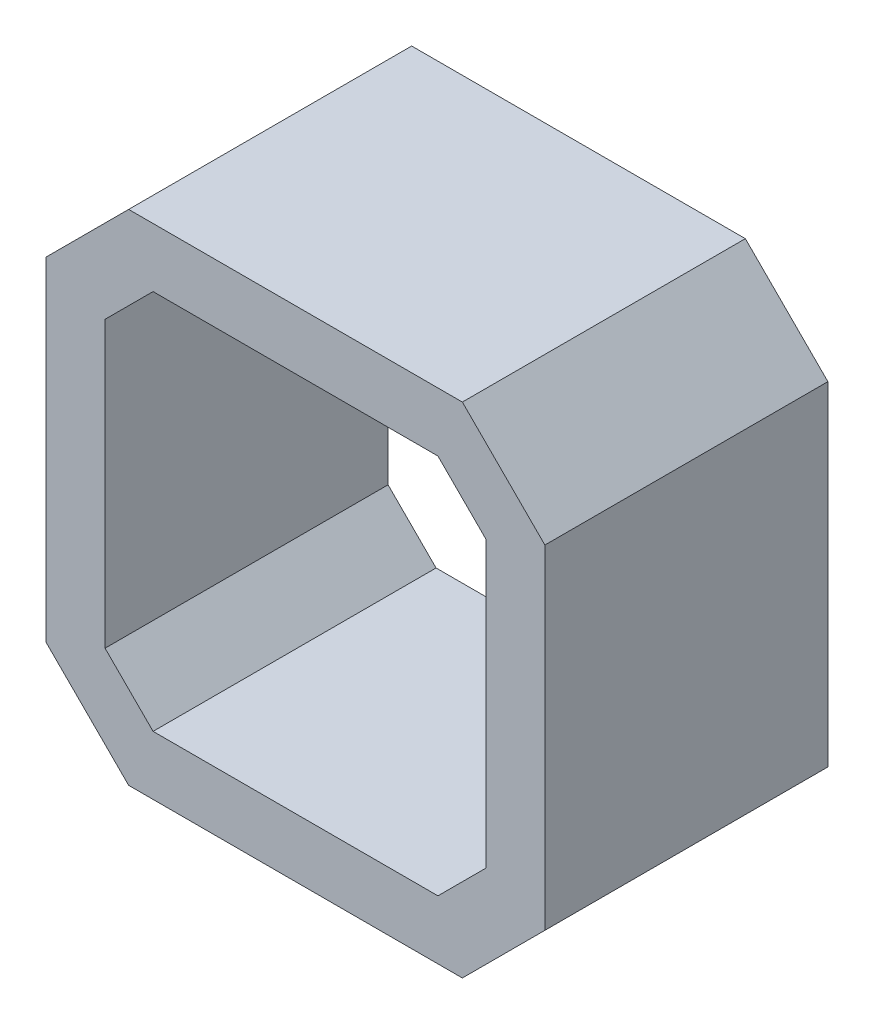
ISO-10303-21;
HEADER;
FILE_DESCRIPTION(('STEP AP214'),'2;1');
FILE_NAME('part.step','',(''),(''),'','','');
FILE_SCHEMA(('AUTOMOTIVE_DESIGN { 1 0 10303 214 1 1 1 1 }'));
ENDSEC;
DATA;
#1=APPLICATION_CONTEXT('core data for automotive mechanical design processes');
#2=APPLICATION_PROTOCOL_DEFINITION('international standard','automotive_design',2000,#1);
#3=PRODUCT_CONTEXT('',#1,'mechanical');
#4=PRODUCT('Part','Part','',(#3));
#5=PRODUCT_RELATED_PRODUCT_CATEGORY('part','',(#4));
#6=PRODUCT_DEFINITION_FORMATION('','',#4);
#7=PRODUCT_DEFINITION_CONTEXT('part definition',#1,'design');
#8=PRODUCT_DEFINITION('design','',#6,#7);
#9=PRODUCT_DEFINITION_SHAPE('','',#8);
#10=(LENGTH_UNIT() NAMED_UNIT(*) SI_UNIT(.MILLI.,.METRE.));
#11=(NAMED_UNIT(*) PLANE_ANGLE_UNIT() SI_UNIT($,.RADIAN.));
#12=(NAMED_UNIT(*) SI_UNIT($,.STERADIAN.) SOLID_ANGLE_UNIT());
#13=UNCERTAINTY_MEASURE_WITH_UNIT(LENGTH_MEASURE(1.E-05),#10,'distance_accuracy_value','');
#14=(GEOMETRIC_REPRESENTATION_CONTEXT(3) GLOBAL_UNCERTAINTY_ASSIGNED_CONTEXT((#13)) GLOBAL_UNIT_ASSIGNED_CONTEXT((#10,
#11,#12)) REPRESENTATION_CONTEXT('',''));
#15=CARTESIAN_POINT('',(0.,0.,0.));
#16=DIRECTION('',(0.,0.,1.));
#17=DIRECTION('',(1.,0.,0.));
#18=AXIS2_PLACEMENT_3D('',#15,#16,#17);
#19=CARTESIAN_POINT('',(0.,0.,24.));
#20=DIRECTION('',(0.,0.,1.));
#21=DIRECTION('',(1.,0.,0.));
#22=AXIS2_PLACEMENT_3D('',#19,#20,#21);
#23=PLANE('',#22);
#24=DIRECTION('',(0.,-1.,0.));
#25=VECTOR('',#24,1.);
#26=CARTESIAN_POINT('',(-21.15,14.15,24.));
#27=LINE('',#26,#25);
#28=CARTESIAN_POINT('',(-21.15,14.15,24.));
#29=VERTEX_POINT('',#28);
#30=CARTESIAN_POINT('',(-21.15,-14.15,24.));
#31=VERTEX_POINT('',#30);
#32=EDGE_CURVE('E221',#29,#31,#27,.T.);
#33=ORIENTED_EDGE('',*,*,#32,.T.);
#34=DIRECTION('',(0.707106781186547,-0.707106781186547,0.));
#35=VECTOR('',#34,1.);
#36=CARTESIAN_POINT('',(-21.15,-14.15,24.));
#37=LINE('',#36,#35);
#38=CARTESIAN_POINT('',(-14.15,-21.15,24.));
#39=VERTEX_POINT('',#38);
#40=EDGE_CURVE('E224',#31,#39,#37,.T.);
#41=ORIENTED_EDGE('',*,*,#40,.T.);
#42=DIRECTION('',(1.,0.,0.));
#43=VECTOR('',#42,1.);
#44=CARTESIAN_POINT('',(-14.15,-21.15,24.));
#45=LINE('',#44,#43);
#46=CARTESIAN_POINT('',(14.15,-21.15,24.));
#47=VERTEX_POINT('',#46);
#48=EDGE_CURVE('E227',#39,#47,#45,.T.);
#49=ORIENTED_EDGE('',*,*,#48,.T.);
#50=DIRECTION('',(0.707106781186547,0.707106781186547,0.));
#51=VECTOR('',#50,1.);
#52=CARTESIAN_POINT('',(14.15,-21.15,24.));
#53=LINE('',#52,#51);
#54=CARTESIAN_POINT('',(21.15,-14.15,24.));
#55=VERTEX_POINT('',#54);
#56=EDGE_CURVE('E229',#47,#55,#53,.T.);
#57=ORIENTED_EDGE('',*,*,#56,.T.);
#58=DIRECTION('',(0.,1.,0.));
#59=VECTOR('',#58,1.);
#60=CARTESIAN_POINT('',(21.15,14.15,24.));
#61=LINE('',#60,#59);
#62=CARTESIAN_POINT('',(21.15,14.15,24.));
#63=VERTEX_POINT('',#62);
#64=EDGE_CURVE('E231',#55,#63,#61,.T.);
#65=ORIENTED_EDGE('',*,*,#64,.T.);
#66=DIRECTION('',(-0.707106781186547,0.707106781186547,0.));
#67=VECTOR('',#66,1.);
#68=CARTESIAN_POINT('',(14.15,21.15,24.));
#69=LINE('',#68,#67);
#70=CARTESIAN_POINT('',(14.15,21.15,24.));
#71=VERTEX_POINT('',#70);
#72=EDGE_CURVE('E233',#63,#71,#69,.T.);
#73=ORIENTED_EDGE('',*,*,#72,.T.);
#74=DIRECTION('',(-1.,0.,0.));
#75=VECTOR('',#74,1.);
#76=CARTESIAN_POINT('',(-14.15,21.15,24.));
#77=LINE('',#76,#75);
#78=CARTESIAN_POINT('',(-14.15,21.15,24.));
#79=VERTEX_POINT('',#78);
#80=EDGE_CURVE('E235',#71,#79,#77,.T.);
#81=ORIENTED_EDGE('',*,*,#80,.T.);
#82=DIRECTION('',(-0.707106781186547,-0.707106781186547,0.));
#83=VECTOR('',#82,1.);
#84=CARTESIAN_POINT('',(-14.15,21.15,24.));
#85=LINE('',#84,#83);
#86=EDGE_CURVE('E237',#79,#29,#85,.T.);
#87=ORIENTED_EDGE('',*,*,#86,.T.);
#88=EDGE_LOOP('',(#33,#41,#49,#57,#65,#73,#81,#87));
#89=FACE_BOUND('',#88,.T.);
#90=DIRECTION('',(0.,-1.,0.));
#91=VECTOR('',#90,1.);
#92=CARTESIAN_POINT('',(-16.15,12.0789321881345,24.));
#93=LINE('',#92,#91);
#94=CARTESIAN_POINT('',(-16.15,12.0789321881345,24.));
#95=VERTEX_POINT('',#94);
#96=CARTESIAN_POINT('',(-16.15,-12.0789321881345,24.));
#97=VERTEX_POINT('',#96);
#98=EDGE_CURVE('E164',#95,#97,#93,.T.);
#99=ORIENTED_EDGE('',*,*,#98,.F.);
#100=DIRECTION('',(-0.707106781186547,-0.707106781186547,0.));
#101=VECTOR('',#100,1.);
#102=CARTESIAN_POINT('',(-12.0789321881345,16.15,24.));
#103=LINE('',#102,#101);
#104=CARTESIAN_POINT('',(-12.0789321881345,16.15,24.));
#105=VERTEX_POINT('',#104);
#106=EDGE_CURVE('E156',#105,#95,#103,.T.);
#107=ORIENTED_EDGE('',*,*,#106,.F.);
#108=DIRECTION('',(-1.,0.,0.));
#109=VECTOR('',#108,1.);
#110=CARTESIAN_POINT('',(-12.0789321881345,16.15,24.));
#111=LINE('',#110,#109);
#112=CARTESIAN_POINT('',(12.0789321881345,16.15,24.));
#113=VERTEX_POINT('',#112);
#114=EDGE_CURVE('E189',#113,#105,#111,.T.);
#115=ORIENTED_EDGE('',*,*,#114,.F.);
#116=DIRECTION('',(-0.707106781186547,0.707106781186547,0.));
#117=VECTOR('',#116,1.);
#118=CARTESIAN_POINT('',(12.0789321881345,16.15,24.));
#119=LINE('',#118,#117);
#120=CARTESIAN_POINT('',(16.15,12.0789321881345,24.));
#121=VERTEX_POINT('',#120);
#122=EDGE_CURVE('E187',#121,#113,#119,.T.);
#123=ORIENTED_EDGE('',*,*,#122,.F.);
#124=DIRECTION('',(0.,1.,0.));
#125=VECTOR('',#124,1.);
#126=CARTESIAN_POINT('',(16.15,12.0789321881345,24.));
#127=LINE('',#126,#125);
#128=CARTESIAN_POINT('',(16.15,-12.0789321881345,24.));
#129=VERTEX_POINT('',#128);
#130=EDGE_CURVE('E185',#129,#121,#127,.T.);
#131=ORIENTED_EDGE('',*,*,#130,.F.);
#132=DIRECTION('',(0.707106781186547,0.707106781186547,0.));
#133=VECTOR('',#132,1.);
#134=CARTESIAN_POINT('',(12.0789321881345,-16.15,24.));
#135=LINE('',#134,#133);
#136=CARTESIAN_POINT('',(12.0789321881345,-16.15,24.));
#137=VERTEX_POINT('',#136);
#138=EDGE_CURVE('E183',#137,#129,#135,.T.);
#139=ORIENTED_EDGE('',*,*,#138,.F.);
#140=DIRECTION('',(1.,0.,0.));
#141=VECTOR('',#140,1.);
#142=CARTESIAN_POINT('',(-12.0789321881345,-16.15,24.));
#143=LINE('',#142,#141);
#144=CARTESIAN_POINT('',(-12.0789321881345,-16.15,24.));
#145=VERTEX_POINT('',#144);
#146=EDGE_CURVE('E179',#145,#137,#143,.T.);
#147=ORIENTED_EDGE('',*,*,#146,.F.);
#148=DIRECTION('',(0.707106781186548,-0.707106781186547,0.));
#149=VECTOR('',#148,1.);
#150=CARTESIAN_POINT('',(-16.15,-12.0789321881345,24.));
#151=LINE('',#150,#149);
#152=EDGE_CURVE('E177',#97,#145,#151,.T.);
#153=ORIENTED_EDGE('',*,*,#152,.F.);
#154=EDGE_LOOP('',(#99,#107,#115,#123,#131,#139,#147,#153));
#155=FACE_BOUND('',#154,.T.);
#156=ADVANCED_FACE('F43',(#89,#155),#23,.T.);
#157=CARTESIAN_POINT('',(0.,0.,0.));
#158=DIRECTION('',(0.,0.,1.));
#159=DIRECTION('',(1.,0.,0.));
#160=AXIS2_PLACEMENT_3D('',#157,#158,#159);
#161=PLANE('',#160);
#162=DIRECTION('',(0.,-1.,0.));
#163=VECTOR('',#162,1.);
#164=CARTESIAN_POINT('',(-21.15,14.15,0.));
#165=LINE('',#164,#163);
#166=CARTESIAN_POINT('',(-21.15,14.15,0.));
#167=VERTEX_POINT('',#166);
#168=CARTESIAN_POINT('',(-21.15,-14.15,0.));
#169=VERTEX_POINT('',#168);
#170=EDGE_CURVE('E172',#167,#169,#165,.T.);
#171=ORIENTED_EDGE('',*,*,#170,.F.);
#172=DIRECTION('',(-0.707106781186547,-0.707106781186547,0.));
#173=VECTOR('',#172,1.);
#174=CARTESIAN_POINT('',(-14.15,21.15,0.));
#175=LINE('',#174,#173);
#176=CARTESIAN_POINT('',(-14.15,21.15,0.));
#177=VERTEX_POINT('',#176);
#178=EDGE_CURVE('E225',#177,#167,#175,.T.);
#179=ORIENTED_EDGE('',*,*,#178,.F.);
#180=DIRECTION('',(-1.,0.,0.));
#181=VECTOR('',#180,1.);
#182=CARTESIAN_POINT('',(-14.15,21.15,0.));
#183=LINE('',#182,#181);
#184=CARTESIAN_POINT('',(14.15,21.15,0.));
#185=VERTEX_POINT('',#184);
#186=EDGE_CURVE('E252',#185,#177,#183,.T.);
#187=ORIENTED_EDGE('',*,*,#186,.F.);
#188=DIRECTION('',(-0.707106781186547,0.707106781186547,0.));
#189=VECTOR('',#188,1.);
#190=CARTESIAN_POINT('',(14.15,21.15,0.));
#191=LINE('',#190,#189);
#192=CARTESIAN_POINT('',(21.15,14.15,0.));
#193=VERTEX_POINT('',#192);
#194=EDGE_CURVE('E250',#193,#185,#191,.T.);
#195=ORIENTED_EDGE('',*,*,#194,.F.);
#196=DIRECTION('',(0.,1.,0.));
#197=VECTOR('',#196,1.);
#198=CARTESIAN_POINT('',(21.15,14.15,0.));
#199=LINE('',#198,#197);
#200=CARTESIAN_POINT('',(21.15,-14.15,0.));
#201=VERTEX_POINT('',#200);
#202=EDGE_CURVE('E248',#201,#193,#199,.T.);
#203=ORIENTED_EDGE('',*,*,#202,.F.);
#204=DIRECTION('',(0.707106781186547,0.707106781186547,0.));
#205=VECTOR('',#204,1.);
#206=CARTESIAN_POINT('',(14.15,-21.15,0.));
#207=LINE('',#206,#205);
#208=CARTESIAN_POINT('',(14.15,-21.15,0.));
#209=VERTEX_POINT('',#208);
#210=EDGE_CURVE('E246',#209,#201,#207,.T.);
#211=ORIENTED_EDGE('',*,*,#210,.F.);
#212=DIRECTION('',(1.,0.,0.));
#213=VECTOR('',#212,1.);
#214=CARTESIAN_POINT('',(-14.15,-21.15,0.));
#215=LINE('',#214,#213);
#216=CARTESIAN_POINT('',(-14.15,-21.15,0.));
#217=VERTEX_POINT('',#216);
#218=EDGE_CURVE('E244',#217,#209,#215,.T.);
#219=ORIENTED_EDGE('',*,*,#218,.F.);
#220=DIRECTION('',(0.707106781186547,-0.707106781186547,0.));
#221=VECTOR('',#220,1.);
#222=CARTESIAN_POINT('',(-21.15,-14.15,0.));
#223=LINE('',#222,#221);
#224=EDGE_CURVE('E242',#169,#217,#223,.T.);
#225=ORIENTED_EDGE('',*,*,#224,.F.);
#226=EDGE_LOOP('',(#171,#179,#187,#195,#203,#211,#219,#225));
#227=FACE_BOUND('',#226,.T.);
#228=DIRECTION('',(-0.707106781186547,-0.707106781186547,0.));
#229=VECTOR('',#228,1.);
#230=CARTESIAN_POINT('',(-12.0789321881345,16.15,0.));
#231=LINE('',#230,#229);
#232=CARTESIAN_POINT('',(-12.0789321881345,16.15,0.));
#233=VERTEX_POINT('',#232);
#234=CARTESIAN_POINT('',(-16.15,12.0789321881345,0.));
#235=VERTEX_POINT('',#234);
#236=EDGE_CURVE('E66',#233,#235,#231,.T.);
#237=ORIENTED_EDGE('',*,*,#236,.T.);
#238=DIRECTION('',(0.,-1.,0.));
#239=VECTOR('',#238,1.);
#240=CARTESIAN_POINT('',(-16.15,12.0789321881345,0.));
#241=LINE('',#240,#239);
#242=CARTESIAN_POINT('',(-16.15,-12.0789321881345,0.));
#243=VERTEX_POINT('',#242);
#244=EDGE_CURVE('E171',#235,#243,#241,.T.);
#245=ORIENTED_EDGE('',*,*,#244,.T.);
#246=DIRECTION('',(0.707106781186548,-0.707106781186547,0.));
#247=VECTOR('',#246,1.);
#248=CARTESIAN_POINT('',(-16.15,-12.0789321881345,0.));
#249=LINE('',#248,#247);
#250=CARTESIAN_POINT('',(-12.0789321881345,-16.15,0.));
#251=VERTEX_POINT('',#250);
#252=EDGE_CURVE('E193',#243,#251,#249,.T.);
#253=ORIENTED_EDGE('',*,*,#252,.T.);
#254=DIRECTION('',(1.,0.,0.));
#255=VECTOR('',#254,1.);
#256=CARTESIAN_POINT('',(-12.0789321881345,-16.15,0.));
#257=LINE('',#256,#255);
#258=CARTESIAN_POINT('',(12.0789321881345,-16.15,0.));
#259=VERTEX_POINT('',#258);
#260=EDGE_CURVE('E196',#251,#259,#257,.T.);
#261=ORIENTED_EDGE('',*,*,#260,.T.);
#262=DIRECTION('',(0.707106781186547,0.707106781186547,0.));
#263=VECTOR('',#262,1.);
#264=CARTESIAN_POINT('',(12.0789321881345,-16.15,0.));
#265=LINE('',#264,#263);
#266=CARTESIAN_POINT('',(16.15,-12.0789321881345,0.));
#267=VERTEX_POINT('',#266);
#268=EDGE_CURVE('E199',#259,#267,#265,.T.);
#269=ORIENTED_EDGE('',*,*,#268,.T.);
#270=DIRECTION('',(0.,1.,0.));
#271=VECTOR('',#270,1.);
#272=CARTESIAN_POINT('',(16.15,12.0789321881345,0.));
#273=LINE('',#272,#271);
#274=CARTESIAN_POINT('',(16.15,12.0789321881345,0.));
#275=VERTEX_POINT('',#274);
#276=EDGE_CURVE('E202',#267,#275,#273,.T.);
#277=ORIENTED_EDGE('',*,*,#276,.T.);
#278=DIRECTION('',(-0.707106781186547,0.707106781186547,0.));
#279=VECTOR('',#278,1.);
#280=CARTESIAN_POINT('',(12.0789321881345,16.15,0.));
#281=LINE('',#280,#279);
#282=CARTESIAN_POINT('',(12.0789321881345,16.15,0.));
#283=VERTEX_POINT('',#282);
#284=EDGE_CURVE('E205',#275,#283,#281,.T.);
#285=ORIENTED_EDGE('',*,*,#284,.T.);
#286=DIRECTION('',(-1.,0.,0.));
#287=VECTOR('',#286,1.);
#288=CARTESIAN_POINT('',(-12.0789321881345,16.15,0.));
#289=LINE('',#288,#287);
#290=EDGE_CURVE('E165',#283,#233,#289,.T.);
#291=ORIENTED_EDGE('',*,*,#290,.T.);
#292=EDGE_LOOP('',(#237,#245,#253,#261,#269,#277,#285,#291));
#293=FACE_BOUND('',#292,.T.);
#294=ADVANCED_FACE('F282',(#227,#293),#161,.F.);
#295=CARTESIAN_POINT('',(-21.15,14.15,24.));
#296=DIRECTION('',(1.,0.,0.));
#297=DIRECTION('',(0.,1.,0.));
#298=AXIS2_PLACEMENT_3D('',#295,#296,#297);
#299=PLANE('',#298);
#300=ORIENTED_EDGE('',*,*,#170,.T.);
#301=DIRECTION('',(0.,0.,-1.));
#302=VECTOR('',#301,1.);
#303=CARTESIAN_POINT('',(-21.15,-14.15,24.));
#304=LINE('',#303,#302);
#305=EDGE_CURVE('E11',#31,#169,#304,.T.);
#306=ORIENTED_EDGE('',*,*,#305,.F.);
#307=ORIENTED_EDGE('',*,*,#32,.F.);
#308=DIRECTION('',(0.,0.,-1.));
#309=VECTOR('',#308,1.);
#310=CARTESIAN_POINT('',(-21.15,14.15,24.));
#311=LINE('',#310,#309);
#312=EDGE_CURVE('E239',#29,#167,#311,.T.);
#313=ORIENTED_EDGE('',*,*,#312,.T.);
#314=EDGE_LOOP('',(#300,#306,#307,#313));
#315=FACE_BOUND('',#314,.T.);
#316=ADVANCED_FACE('F45',(#315),#299,.F.);
#317=CARTESIAN_POINT('',(-21.15,-14.15,24.));
#318=DIRECTION('',(0.707106781186548,0.707106781186548,0.));
#319=DIRECTION('',(-0.707106781186548,0.707106781186548,0.));
#320=AXIS2_PLACEMENT_3D('',#317,#318,#319);
#321=PLANE('',#320);
#322=ORIENTED_EDGE('',*,*,#224,.T.);
#323=DIRECTION('',(0.,0.,-1.));
#324=VECTOR('',#323,1.);
#325=CARTESIAN_POINT('',(-14.15,-21.15,24.));
#326=LINE('',#325,#324);
#327=EDGE_CURVE('E51',#39,#217,#326,.T.);
#328=ORIENTED_EDGE('',*,*,#327,.F.);
#329=ORIENTED_EDGE('',*,*,#40,.F.);
#330=ORIENTED_EDGE('',*,*,#305,.T.);
#331=EDGE_LOOP('',(#322,#328,#329,#330));
#332=FACE_BOUND('',#331,.T.);
#333=ADVANCED_FACE('F299',(#332),#321,.F.);
#334=CARTESIAN_POINT('',(-14.15,-21.15,24.));
#335=DIRECTION('',(0.,1.,0.));
#336=DIRECTION('',(0.,0.,1.));
#337=AXIS2_PLACEMENT_3D('',#334,#335,#336);
#338=PLANE('',#337);
#339=ORIENTED_EDGE('',*,*,#218,.T.);
#340=DIRECTION('',(0.,0.,-1.));
#341=VECTOR('',#340,1.);
#342=CARTESIAN_POINT('',(14.15,-21.15,24.));
#343=LINE('',#342,#341);
#344=EDGE_CURVE('E269',#47,#209,#343,.T.);
#345=ORIENTED_EDGE('',*,*,#344,.F.);
#346=ORIENTED_EDGE('',*,*,#48,.F.);
#347=ORIENTED_EDGE('',*,*,#327,.T.);
#348=EDGE_LOOP('',(#339,#345,#346,#347));
#349=FACE_BOUND('',#348,.T.);
#350=ADVANCED_FACE('F276',(#349),#338,.F.);
#351=CARTESIAN_POINT('',(14.15,-21.15,24.));
#352=DIRECTION('',(-0.707106781186548,0.707106781186548,0.));
#353=DIRECTION('',(-0.707106781186548,-0.707106781186548,0.));
#354=AXIS2_PLACEMENT_3D('',#351,#352,#353);
#355=PLANE('',#354);
#356=ORIENTED_EDGE('',*,*,#210,.T.);
#357=DIRECTION('',(0.,0.,-1.));
#358=VECTOR('',#357,1.);
#359=CARTESIAN_POINT('',(21.15,-14.15,24.));
#360=LINE('',#359,#358);
#361=EDGE_CURVE('E266',#55,#201,#360,.T.);
#362=ORIENTED_EDGE('',*,*,#361,.F.);
#363=ORIENTED_EDGE('',*,*,#56,.F.);
#364=ORIENTED_EDGE('',*,*,#344,.T.);
#365=EDGE_LOOP('',(#356,#362,#363,#364));
#366=FACE_BOUND('',#365,.T.);
#367=ADVANCED_FACE('F288',(#366),#355,.F.);
#368=CARTESIAN_POINT('',(21.15,14.15,24.));
#369=DIRECTION('',(-1.,0.,0.));
#370=DIRECTION('',(0.,-1.,0.));
#371=AXIS2_PLACEMENT_3D('',#368,#369,#370);
#372=PLANE('',#371);
#373=ORIENTED_EDGE('',*,*,#202,.T.);
#374=DIRECTION('',(0.,0.,-1.));
#375=VECTOR('',#374,1.);
#376=CARTESIAN_POINT('',(21.15,14.15,24.));
#377=LINE('',#376,#375);
#378=EDGE_CURVE('E263',#63,#193,#377,.T.);
#379=ORIENTED_EDGE('',*,*,#378,.F.);
#380=ORIENTED_EDGE('',*,*,#64,.F.);
#381=ORIENTED_EDGE('',*,*,#361,.T.);
#382=EDGE_LOOP('',(#373,#379,#380,#381));
#383=FACE_BOUND('',#382,.T.);
#384=ADVANCED_FACE('F292',(#383),#372,.F.);
#385=CARTESIAN_POINT('',(14.15,21.15,24.));
#386=DIRECTION('',(-0.707106781186548,-0.707106781186548,0.));
#387=DIRECTION('',(0.707106781186548,-0.707106781186548,0.));
#388=AXIS2_PLACEMENT_3D('',#385,#386,#387);
#389=PLANE('',#388);
#390=ORIENTED_EDGE('',*,*,#194,.T.);
#391=DIRECTION('',(0.,0.,-1.));
#392=VECTOR('',#391,1.);
#393=CARTESIAN_POINT('',(14.15,21.15,24.));
#394=LINE('',#393,#392);
#395=EDGE_CURVE('E260',#71,#185,#394,.T.);
#396=ORIENTED_EDGE('',*,*,#395,.F.);
#397=ORIENTED_EDGE('',*,*,#72,.F.);
#398=ORIENTED_EDGE('',*,*,#378,.T.);
#399=EDGE_LOOP('',(#390,#396,#397,#398));
#400=FACE_BOUND('',#399,.T.);
#401=ADVANCED_FACE('F312',(#400),#389,.F.);
#402=CARTESIAN_POINT('',(-14.15,21.15,24.));
#403=DIRECTION('',(0.,-1.,0.));
#404=DIRECTION('',(0.,0.,-1.));
#405=AXIS2_PLACEMENT_3D('',#402,#403,#404);
#406=PLANE('',#405);
#407=ORIENTED_EDGE('',*,*,#186,.T.);
#408=DIRECTION('',(0.,0.,-1.));
#409=VECTOR('',#408,1.);
#410=CARTESIAN_POINT('',(-14.15,21.15,24.));
#411=LINE('',#410,#409);
#412=EDGE_CURVE('E257',#79,#177,#411,.T.);
#413=ORIENTED_EDGE('',*,*,#412,.F.);
#414=ORIENTED_EDGE('',*,*,#80,.F.);
#415=ORIENTED_EDGE('',*,*,#395,.T.);
#416=EDGE_LOOP('',(#407,#413,#414,#415));
#417=FACE_BOUND('',#416,.T.);
#418=ADVANCED_FACE('F310',(#417),#406,.F.);
#419=CARTESIAN_POINT('',(-14.15,21.15,24.));
#420=DIRECTION('',(0.707106781186548,-0.707106781186548,0.));
#421=DIRECTION('',(0.707106781186548,0.707106781186548,0.));
#422=AXIS2_PLACEMENT_3D('',#419,#420,#421);
#423=PLANE('',#422);
#424=ORIENTED_EDGE('',*,*,#178,.T.);
#425=ORIENTED_EDGE('',*,*,#312,.F.);
#426=ORIENTED_EDGE('',*,*,#86,.F.);
#427=ORIENTED_EDGE('',*,*,#412,.T.);
#428=EDGE_LOOP('',(#424,#425,#426,#427));
#429=FACE_BOUND('',#428,.T.);
#430=ADVANCED_FACE('F305',(#429),#423,.F.);
#431=CARTESIAN_POINT('',(-12.0789321881345,16.15,24.));
#432=DIRECTION('',(0.707106781186548,-0.707106781186548,0.));
#433=DIRECTION('',(0.707106781186548,0.707106781186548,0.));
#434=AXIS2_PLACEMENT_3D('',#431,#432,#433);
#435=PLANE('',#434);
#436=ORIENTED_EDGE('',*,*,#236,.F.);
#437=DIRECTION('',(0.,0.,-1.));
#438=VECTOR('',#437,1.);
#439=CARTESIAN_POINT('',(-12.0789321881345,16.15,24.));
#440=LINE('',#439,#438);
#441=EDGE_CURVE('E160',#105,#233,#440,.T.);
#442=ORIENTED_EDGE('',*,*,#441,.F.);
#443=ORIENTED_EDGE('',*,*,#106,.T.);
#444=DIRECTION('',(0.,0.,-1.));
#445=VECTOR('',#444,1.);
#446=CARTESIAN_POINT('',(-16.15,12.0789321881345,24.));
#447=LINE('',#446,#445);
#448=EDGE_CURVE('E159',#95,#235,#447,.T.);
#449=ORIENTED_EDGE('',*,*,#448,.T.);
#450=EDGE_LOOP('',(#436,#442,#443,#449));
#451=FACE_BOUND('',#450,.T.);
#452=ADVANCED_FACE('F158',(#451),#435,.T.);
#453=CARTESIAN_POINT('',(-16.15,12.0789321881345,24.));
#454=DIRECTION('',(1.,0.,0.));
#455=DIRECTION('',(0.,0.,-1.));
#456=AXIS2_PLACEMENT_3D('',#453,#454,#455);
#457=PLANE('',#456);
#458=ORIENTED_EDGE('',*,*,#244,.F.);
#459=ORIENTED_EDGE('',*,*,#448,.F.);
#460=ORIENTED_EDGE('',*,*,#98,.T.);
#461=DIRECTION('',(0.,0.,-1.));
#462=VECTOR('',#461,1.);
#463=CARTESIAN_POINT('',(-16.15,-12.0789321881345,24.));
#464=LINE('',#463,#462);
#465=EDGE_CURVE('E173',#97,#243,#464,.T.);
#466=ORIENTED_EDGE('',*,*,#465,.T.);
#467=EDGE_LOOP('',(#458,#459,#460,#466));
#468=FACE_BOUND('',#467,.T.);
#469=ADVANCED_FACE('F168',(#468),#457,.T.);
#470=CARTESIAN_POINT('',(-16.15,-12.0789321881345,24.));
#471=DIRECTION('',(0.707106781186547,0.707106781186548,0.));
#472=DIRECTION('',(-0.707106781186548,0.707106781186547,0.));
#473=AXIS2_PLACEMENT_3D('',#470,#471,#472);
#474=PLANE('',#473);
#475=ORIENTED_EDGE('',*,*,#252,.F.);
#476=ORIENTED_EDGE('',*,*,#465,.F.);
#477=ORIENTED_EDGE('',*,*,#152,.T.);
#478=DIRECTION('',(0.,0.,-1.));
#479=VECTOR('',#478,1.);
#480=CARTESIAN_POINT('',(-12.0789321881345,-16.15,24.));
#481=LINE('',#480,#479);
#482=EDGE_CURVE('E218',#145,#251,#481,.T.);
#483=ORIENTED_EDGE('',*,*,#482,.T.);
#484=EDGE_LOOP('',(#475,#476,#477,#483));
#485=FACE_BOUND('',#484,.T.);
#486=ADVANCED_FACE('F337',(#485),#474,.T.);
#487=CARTESIAN_POINT('',(-12.0789321881345,-16.15,24.));
#488=DIRECTION('',(0.,1.,0.));
#489=DIRECTION('',(0.,0.,1.));
#490=AXIS2_PLACEMENT_3D('',#487,#488,#489);
#491=PLANE('',#490);
#492=ORIENTED_EDGE('',*,*,#260,.F.);
#493=ORIENTED_EDGE('',*,*,#482,.F.);
#494=ORIENTED_EDGE('',*,*,#146,.T.);
#495=DIRECTION('',(0.,0.,-1.));
#496=VECTOR('',#495,1.);
#497=CARTESIAN_POINT('',(12.0789321881345,-16.15,24.));
#498=LINE('',#497,#496);
#499=EDGE_CURVE('E216',#137,#259,#498,.T.);
#500=ORIENTED_EDGE('',*,*,#499,.T.);
#501=EDGE_LOOP('',(#492,#493,#494,#500));
#502=FACE_BOUND('',#501,.T.);
#503=ADVANCED_FACE('F341',(#502),#491,.T.);
#504=CARTESIAN_POINT('',(12.0789321881345,-16.15,24.));
#505=DIRECTION('',(-0.707106781186548,0.707106781186548,0.));
#506=DIRECTION('',(-0.707106781186548,-0.707106781186548,0.));
#507=AXIS2_PLACEMENT_3D('',#504,#505,#506);
#508=PLANE('',#507);
#509=ORIENTED_EDGE('',*,*,#268,.F.);
#510=ORIENTED_EDGE('',*,*,#499,.F.);
#511=ORIENTED_EDGE('',*,*,#138,.T.);
#512=DIRECTION('',(0.,0.,-1.));
#513=VECTOR('',#512,1.);
#514=CARTESIAN_POINT('',(16.15,-12.0789321881345,24.));
#515=LINE('',#514,#513);
#516=EDGE_CURVE('E214',#129,#267,#515,.T.);
#517=ORIENTED_EDGE('',*,*,#516,.T.);
#518=EDGE_LOOP('',(#509,#510,#511,#517));
#519=FACE_BOUND('',#518,.T.);
#520=ADVANCED_FACE('F347',(#519),#508,.T.);
#521=CARTESIAN_POINT('',(16.15,12.0789321881345,24.));
#522=DIRECTION('',(-1.,0.,0.));
#523=DIRECTION('',(0.,0.,1.));
#524=AXIS2_PLACEMENT_3D('',#521,#522,#523);
#525=PLANE('',#524);
#526=ORIENTED_EDGE('',*,*,#276,.F.);
#527=ORIENTED_EDGE('',*,*,#516,.F.);
#528=ORIENTED_EDGE('',*,*,#130,.T.);
#529=DIRECTION('',(0.,0.,-1.));
#530=VECTOR('',#529,1.);
#531=CARTESIAN_POINT('',(16.15,12.0789321881345,24.));
#532=LINE('',#531,#530);
#533=EDGE_CURVE('E212',#121,#275,#532,.T.);
#534=ORIENTED_EDGE('',*,*,#533,.T.);
#535=EDGE_LOOP('',(#526,#527,#528,#534));
#536=FACE_BOUND('',#535,.T.);
#537=ADVANCED_FACE('F351',(#536),#525,.T.);
#538=CARTESIAN_POINT('',(12.0789321881345,16.15,24.));
#539=DIRECTION('',(-0.707106781186548,-0.707106781186548,0.));
#540=DIRECTION('',(0.707106781186548,-0.707106781186548,0.));
#541=AXIS2_PLACEMENT_3D('',#538,#539,#540);
#542=PLANE('',#541);
#543=ORIENTED_EDGE('',*,*,#284,.F.);
#544=ORIENTED_EDGE('',*,*,#533,.F.);
#545=ORIENTED_EDGE('',*,*,#122,.T.);
#546=DIRECTION('',(0.,0.,-1.));
#547=VECTOR('',#546,1.);
#548=CARTESIAN_POINT('',(12.0789321881345,16.15,24.));
#549=LINE('',#548,#547);
#550=EDGE_CURVE('E58',#113,#283,#549,.T.);
#551=ORIENTED_EDGE('',*,*,#550,.T.);
#552=EDGE_LOOP('',(#543,#544,#545,#551));
#553=FACE_BOUND('',#552,.T.);
#554=ADVANCED_FACE('F355',(#553),#542,.T.);
#555=CARTESIAN_POINT('',(-12.0789321881345,16.15,24.));
#556=DIRECTION('',(0.,-1.,0.));
#557=DIRECTION('',(0.,0.,-1.));
#558=AXIS2_PLACEMENT_3D('',#555,#556,#557);
#559=PLANE('',#558);
#560=ORIENTED_EDGE('',*,*,#290,.F.);
#561=ORIENTED_EDGE('',*,*,#550,.F.);
#562=ORIENTED_EDGE('',*,*,#114,.T.);
#563=ORIENTED_EDGE('',*,*,#441,.T.);
#564=EDGE_LOOP('',(#560,#561,#562,#563));
#565=FACE_BOUND('',#564,.T.);
#566=ADVANCED_FACE('F359',(#565),#559,.T.);
#567=CLOSED_SHELL('',(#156,#294,#316,#333,#350,#367,#384,#401,#418,#430,#452,#469,#486,#503,
#520,#537,#554,#566));
#568=MANIFOLD_SOLID_BREP('B2',#567);
#569=ADVANCED_BREP_SHAPE_REPRESENTATION('',(#18,#568),#14);
#570=SHAPE_DEFINITION_REPRESENTATION(#9,#569);
ENDSEC;
END-ISO-10303-21;
